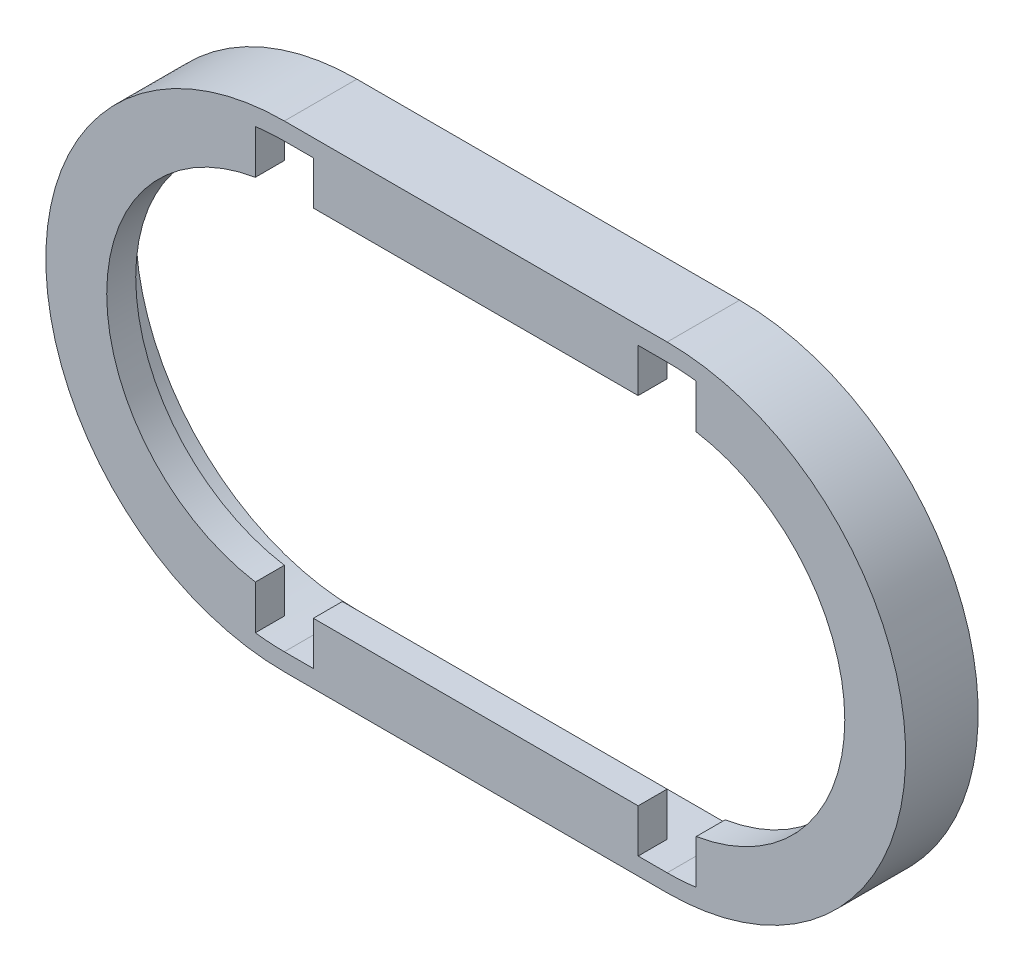
ISO-10303-21;
HEADER;
FILE_DESCRIPTION(('STEP AP214'),'2;1');
FILE_NAME('part.step','',(''),(''),'','','');
FILE_SCHEMA(('AUTOMOTIVE_DESIGN { 1 0 10303 214 1 1 1 1 }'));
ENDSEC;
DATA;
#1=APPLICATION_CONTEXT('core data for automotive mechanical design processes');
#2=APPLICATION_PROTOCOL_DEFINITION('international standard','automotive_design',2000,#1);
#3=PRODUCT_CONTEXT('',#1,'mechanical');
#4=PRODUCT('Part','Part','',(#3));
#5=PRODUCT_RELATED_PRODUCT_CATEGORY('part','',(#4));
#6=PRODUCT_DEFINITION_FORMATION('','',#4);
#7=PRODUCT_DEFINITION_CONTEXT('part definition',#1,'design');
#8=PRODUCT_DEFINITION('design','',#6,#7);
#9=PRODUCT_DEFINITION_SHAPE('','',#8);
#10=(LENGTH_UNIT() NAMED_UNIT(*) SI_UNIT(.MILLI.,.METRE.));
#11=(NAMED_UNIT(*) PLANE_ANGLE_UNIT() SI_UNIT($,.RADIAN.));
#12=(NAMED_UNIT(*) SI_UNIT($,.STERADIAN.) SOLID_ANGLE_UNIT());
#13=UNCERTAINTY_MEASURE_WITH_UNIT(LENGTH_MEASURE(1.E-05),#10,'distance_accuracy_value','');
#14=(GEOMETRIC_REPRESENTATION_CONTEXT(3) GLOBAL_UNCERTAINTY_ASSIGNED_CONTEXT((#13)) GLOBAL_UNIT_ASSIGNED_CONTEXT((#10,
#11,#12)) REPRESENTATION_CONTEXT('',''));
#15=CARTESIAN_POINT('',(0.,0.,0.));
#16=DIRECTION('',(0.,0.,1.));
#17=DIRECTION('',(1.,0.,0.));
#18=AXIS2_PLACEMENT_3D('',#15,#16,#17);
#19=CARTESIAN_POINT('',(-34.3844441888366,-11.7807833808039,2.));
#20=DIRECTION('',(0.,1.,0.));
#21=DIRECTION('',(0.,0.,1.));
#22=AXIS2_PLACEMENT_3D('',#19,#20,#21);
#23=PLANE('',#22);
#24=DIRECTION('',(-1.,0.,0.));
#25=VECTOR('',#24,1.);
#26=CARTESIAN_POINT('',(0.,-11.7807833808039,0.));
#27=LINE('',#26,#25);
#28=CARTESIAN_POINT('',(-9.98444418883663,-11.7807833808039,0.));
#29=VERTEX_POINT('',#28);
#30=CARTESIAN_POINT('',(-32.3844441888366,-11.7807833808039,0.));
#31=VERTEX_POINT('',#30);
#32=EDGE_CURVE('E50',#29,#31,#27,.T.);
#33=ORIENTED_EDGE('',*,*,#32,.F.);
#34=DIRECTION('',(0.,0.,1.));
#35=VECTOR('',#34,1.);
#36=CARTESIAN_POINT('',(-9.98444418883663,-11.7807833808039,0.));
#37=LINE('',#36,#35);
#38=CARTESIAN_POINT('',(-9.98444418883663,-11.7807833808039,2.));
#39=VERTEX_POINT('',#38);
#40=EDGE_CURVE('E227',#29,#39,#37,.T.);
#41=ORIENTED_EDGE('',*,*,#40,.T.);
#42=DIRECTION('',(1.,0.,0.));
#43=VECTOR('',#42,1.);
#44=CARTESIAN_POINT('',(-34.3844441888366,-11.7807833808039,2.));
#45=LINE('',#44,#43);
#46=CARTESIAN_POINT('',(-7.98444418883663,-11.7807833808039,2.));
#47=VERTEX_POINT('',#46);
#48=EDGE_CURVE('E339',#39,#47,#45,.T.);
#49=ORIENTED_EDGE('',*,*,#48,.T.);
#50=DIRECTION('',(0.,0.,-1.));
#51=VECTOR('',#50,1.);
#52=CARTESIAN_POINT('',(-7.98444418883663,-11.7807833808039,2.));
#53=LINE('',#52,#51);
#54=CARTESIAN_POINT('',(-7.98444418883663,-11.7807833808039,-3.));
#55=VERTEX_POINT('',#54);
#56=EDGE_CURVE('E352',#47,#55,#53,.T.);
#57=ORIENTED_EDGE('',*,*,#56,.T.);
#58=DIRECTION('',(1.,0.,0.));
#59=VECTOR('',#58,1.);
#60=CARTESIAN_POINT('',(-34.3844441888366,-11.7807833808039,-3.));
#61=LINE('',#60,#59);
#62=CARTESIAN_POINT('',(-34.3844441888366,-11.7807833808039,-3.));
#63=VERTEX_POINT('',#62);
#64=EDGE_CURVE('E315',#63,#55,#61,.T.);
#65=ORIENTED_EDGE('',*,*,#64,.F.);
#66=DIRECTION('',(0.,0.,-1.));
#67=VECTOR('',#66,1.);
#68=CARTESIAN_POINT('',(-34.3844441888366,-11.7807833808039,2.));
#69=LINE('',#68,#67);
#70=CARTESIAN_POINT('',(-34.3844441888366,-11.7807833808039,2.));
#71=VERTEX_POINT('',#70);
#72=EDGE_CURVE('E354',#71,#63,#69,.T.);
#73=ORIENTED_EDGE('',*,*,#72,.F.);
#74=CARTESIAN_POINT('',(-32.3844441888366,-11.7807833808039,2.));
#75=VERTEX_POINT('',#74);
#76=EDGE_CURVE('E340',#71,#75,#45,.T.);
#77=ORIENTED_EDGE('',*,*,#76,.T.);
#78=DIRECTION('',(0.,0.,1.));
#79=VECTOR('',#78,1.);
#80=CARTESIAN_POINT('',(-32.3844441888366,-11.7807833808039,0.));
#81=LINE('',#80,#79);
#82=EDGE_CURVE('E55',#31,#75,#81,.T.);
#83=ORIENTED_EDGE('',*,*,#82,.F.);
#84=EDGE_LOOP('',(#33,#41,#49,#57,#65,#73,#77,#83));
#85=FACE_BOUND('',#84,.T.);
#86=ADVANCED_FACE('F35',(#85),#23,.T.);
#87=CARTESIAN_POINT('',(-34.3844441888366,3.46921661919612,2.));
#88=DIRECTION('',(0.,0.,-1.));
#89=DIRECTION('',(-1.,0.,0.));
#90=AXIS2_PLACEMENT_3D('',#87,#88,#89);
#91=CYLINDRICAL_SURFACE('',#90,15.25);
#92=CARTESIAN_POINT('',(-34.3844441888366,3.46921661919612,0.));
#93=DIRECTION('',(0.,0.,1.));
#94=DIRECTION('',(1.,0.,0.));
#95=AXIS2_PLACEMENT_3D('',#92,#93,#94);
#96=CIRCLE('',#95,15.25);
#97=CARTESIAN_POINT('',(-36.3844441888366,-11.6490670135447,0.));
#98=VERTEX_POINT('',#97);
#99=CARTESIAN_POINT('',(-36.3844441888366,18.587500251937,0.));
#100=VERTEX_POINT('',#99);
#101=EDGE_CURVE('E292',#98,#100,#96,.F.);
#102=ORIENTED_EDGE('',*,*,#101,.F.);
#103=DIRECTION('',(0.,0.,1.));
#104=VECTOR('',#103,1.);
#105=CARTESIAN_POINT('',(-36.3844441888366,-11.6490670135447,0.));
#106=LINE('',#105,#104);
#107=CARTESIAN_POINT('',(-36.3844441888366,-11.6490670135447,2.));
#108=VERTEX_POINT('',#107);
#109=EDGE_CURVE('E304',#98,#108,#106,.T.);
#110=ORIENTED_EDGE('',*,*,#109,.T.);
#111=CARTESIAN_POINT('',(-34.3844441888366,3.46921661919612,2.));
#112=DIRECTION('',(0.,0.,1.));
#113=DIRECTION('',(1.,0.,0.));
#114=AXIS2_PLACEMENT_3D('',#111,#112,#113);
#115=CIRCLE('',#114,15.25);
#116=EDGE_CURVE('E336',#108,#71,#115,.T.);
#117=ORIENTED_EDGE('',*,*,#116,.T.);
#118=ORIENTED_EDGE('',*,*,#72,.T.);
#119=CARTESIAN_POINT('',(-34.3844441888366,3.46921661919612,-3.));
#120=DIRECTION('',(0.,0.,1.));
#121=DIRECTION('',(1.,0.,0.));
#122=AXIS2_PLACEMENT_3D('',#119,#120,#121);
#123=CIRCLE('',#122,15.25);
#124=CARTESIAN_POINT('',(-34.3844441888366,18.7192166191961,-3.));
#125=VERTEX_POINT('',#124);
#126=EDGE_CURVE('E303',#125,#63,#123,.T.);
#127=ORIENTED_EDGE('',*,*,#126,.F.);
#128=DIRECTION('',(0.,0.,-1.));
#129=VECTOR('',#128,1.);
#130=CARTESIAN_POINT('',(-34.3844441888366,18.7192166191961,2.));
#131=LINE('',#130,#129);
#132=CARTESIAN_POINT('',(-34.3844441888366,18.7192166191961,2.));
#133=VERTEX_POINT('',#132);
#134=EDGE_CURVE('E348',#133,#125,#131,.T.);
#135=ORIENTED_EDGE('',*,*,#134,.F.);
#136=CARTESIAN_POINT('',(-36.3844441888366,18.587500251937,2.));
#137=VERTEX_POINT('',#136);
#138=EDGE_CURVE('E337',#133,#137,#115,.T.);
#139=ORIENTED_EDGE('',*,*,#138,.T.);
#140=DIRECTION('',(0.,0.,1.));
#141=VECTOR('',#140,1.);
#142=CARTESIAN_POINT('',(-36.3844441888366,18.587500251937,0.));
#143=LINE('',#142,#141);
#144=EDGE_CURVE('E307',#100,#137,#143,.T.);
#145=ORIENTED_EDGE('',*,*,#144,.F.);
#146=EDGE_LOOP('',(#102,#110,#117,#118,#127,#135,#139,#145));
#147=FACE_BOUND('',#146,.T.);
#148=ADVANCED_FACE('F392',(#147),#91,.F.);
#149=CARTESIAN_POINT('',(-34.3844441888366,3.46921661919612,2.));
#150=DIRECTION('',(0.,0.,1.));
#151=DIRECTION('',(1.,0.,0.));
#152=AXIS2_PLACEMENT_3D('',#149,#150,#151);
#153=PLANE('',#152);
#154=CARTESIAN_POINT('',(-34.3844441888366,3.46921661919612,2.));
#155=DIRECTION('',(0.,0.,1.));
#156=DIRECTION('',(1.,0.,0.));
#157=AXIS2_PLACEMENT_3D('',#154,#155,#156);
#158=CIRCLE('',#157,16.45);
#159=CARTESIAN_POINT('',(-34.3844441888366,19.9192166191961,2.));
#160=VERTEX_POINT('',#159);
#161=CARTESIAN_POINT('',(-34.3844441888366,-12.9807833808039,2.));
#162=VERTEX_POINT('',#161);
#163=EDGE_CURVE('E356',#160,#162,#158,.T.);
#164=ORIENTED_EDGE('',*,*,#163,.T.);
#165=DIRECTION('',(1.,0.,0.));
#166=VECTOR('',#165,1.);
#167=CARTESIAN_POINT('',(-34.3844441888366,-12.9807833808039,2.));
#168=LINE('',#167,#166);
#169=CARTESIAN_POINT('',(-7.98444418883663,-12.9807833808039,2.));
#170=VERTEX_POINT('',#169);
#171=EDGE_CURVE('E359',#162,#170,#168,.T.);
#172=ORIENTED_EDGE('',*,*,#171,.T.);
#173=CARTESIAN_POINT('',(-7.98444418883663,3.46921661919612,2.));
#174=DIRECTION('',(0.,0.,1.));
#175=DIRECTION('',(1.,0.,0.));
#176=AXIS2_PLACEMENT_3D('',#173,#174,#175);
#177=CIRCLE('',#176,16.45);
#178=CARTESIAN_POINT('',(-7.98444418883663,19.9192166191961,2.));
#179=VERTEX_POINT('',#178);
#180=EDGE_CURVE('E361',#170,#179,#177,.T.);
#181=ORIENTED_EDGE('',*,*,#180,.T.);
#182=DIRECTION('',(-1.,0.,0.));
#183=VECTOR('',#182,1.);
#184=CARTESIAN_POINT('',(-34.3844441888366,19.9192166191961,2.));
#185=LINE('',#184,#183);
#186=EDGE_CURVE('E363',#179,#160,#185,.T.);
#187=ORIENTED_EDGE('',*,*,#186,.T.);
#188=EDGE_LOOP('',(#164,#172,#181,#187));
#189=FACE_BOUND('',#188,.T.);
#190=ORIENTED_EDGE('',*,*,#76,.F.);
#191=ORIENTED_EDGE('',*,*,#116,.F.);
#192=DIRECTION('',(0.,-1.,0.));
#193=VECTOR('',#192,1.);
#194=CARTESIAN_POINT('',(-36.3844441888366,0.,2.));
#195=LINE('',#194,#193);
#196=CARTESIAN_POINT('',(-36.3844441888366,-8.6164153460757,2.));
#197=VERTEX_POINT('',#196);
#198=EDGE_CURVE('E290',#197,#108,#195,.T.);
#199=ORIENTED_EDGE('',*,*,#198,.F.);
#200=CARTESIAN_POINT('',(-34.3844441888366,3.46921661919612,2.));
#201=DIRECTION('',(0.,0.,1.));
#202=DIRECTION('',(1.,0.,0.));
#203=AXIS2_PLACEMENT_3D('',#200,#201,#202);
#204=CIRCLE('',#203,12.25);
#205=CARTESIAN_POINT('',(-36.3844441888366,15.5548485844679,2.));
#206=VERTEX_POINT('',#205);
#207=EDGE_CURVE('E279',#206,#197,#204,.T.);
#208=ORIENTED_EDGE('',*,*,#207,.F.);
#209=EDGE_CURVE('E298',#137,#206,#195,.T.);
#210=ORIENTED_EDGE('',*,*,#209,.F.);
#211=ORIENTED_EDGE('',*,*,#138,.F.);
#212=DIRECTION('',(-1.,0.,0.));
#213=VECTOR('',#212,1.);
#214=CARTESIAN_POINT('',(-34.3844441888366,18.7192166191961,2.));
#215=LINE('',#214,#213);
#216=CARTESIAN_POINT('',(-32.3844441888366,18.7192166191961,2.));
#217=VERTEX_POINT('',#216);
#218=EDGE_CURVE('E345',#217,#133,#215,.T.);
#219=ORIENTED_EDGE('',*,*,#218,.F.);
#220=DIRECTION('',(0.,-1.,0.));
#221=VECTOR('',#220,1.);
#222=CARTESIAN_POINT('',(-32.3844441888366,0.,2.));
#223=LINE('',#222,#221);
#224=CARTESIAN_POINT('',(-32.3844441888366,15.7192166191961,2.));
#225=VERTEX_POINT('',#224);
#226=EDGE_CURVE('E247',#217,#225,#223,.T.);
#227=ORIENTED_EDGE('',*,*,#226,.T.);
#228=DIRECTION('',(1.,0.,0.));
#229=VECTOR('',#228,1.);
#230=CARTESIAN_POINT('',(0.,15.7192166191961,2.));
#231=LINE('',#230,#229);
#232=CARTESIAN_POINT('',(-9.98444418883663,15.7192166191961,2.));
#233=VERTEX_POINT('',#232);
#234=EDGE_CURVE('E271',#225,#233,#231,.T.);
#235=ORIENTED_EDGE('',*,*,#234,.T.);
#236=DIRECTION('',(0.,-1.,0.));
#237=VECTOR('',#236,1.);
#238=CARTESIAN_POINT('',(-9.98444418883663,0.,2.));
#239=LINE('',#238,#237);
#240=CARTESIAN_POINT('',(-9.98444418883663,18.7192166191961,2.));
#241=VERTEX_POINT('',#240);
#242=EDGE_CURVE('E260',#241,#233,#239,.T.);
#243=ORIENTED_EDGE('',*,*,#242,.F.);
#244=CARTESIAN_POINT('',(-7.98444418883663,18.7192166191961,2.));
#245=VERTEX_POINT('',#244);
#246=EDGE_CURVE('E346',#245,#241,#215,.T.);
#247=ORIENTED_EDGE('',*,*,#246,.F.);
#248=CARTESIAN_POINT('',(-7.98444418883663,3.46921661919612,2.));
#249=DIRECTION('',(0.,0.,1.));
#250=DIRECTION('',(1.,0.,0.));
#251=AXIS2_PLACEMENT_3D('',#248,#249,#250);
#252=CIRCLE('',#251,15.25);
#253=CARTESIAN_POINT('',(-5.98444418883663,18.587500251937,2.));
#254=VERTEX_POINT('',#253);
#255=EDGE_CURVE('E342',#254,#245,#252,.T.);
#256=ORIENTED_EDGE('',*,*,#255,.F.);
#257=DIRECTION('',(0.,-1.,0.));
#258=VECTOR('',#257,1.);
#259=CARTESIAN_POINT('',(-5.98444418883663,0.,2.));
#260=LINE('',#259,#258);
#261=CARTESIAN_POINT('',(-5.98444418883663,15.554848584468,2.));
#262=VERTEX_POINT('',#261);
#263=EDGE_CURVE('E233',#254,#262,#260,.T.);
#264=ORIENTED_EDGE('',*,*,#263,.T.);
#265=CARTESIAN_POINT('',(-7.98444418883655,3.46921661919613,2.));
#266=DIRECTION('',(0.,0.,1.));
#267=DIRECTION('',(1.,0.,0.));
#268=AXIS2_PLACEMENT_3D('',#265,#266,#267);
#269=CIRCLE('',#268,12.25);
#270=CARTESIAN_POINT('',(-5.98444418883663,-8.61641534607571,2.));
#271=VERTEX_POINT('',#270);
#272=EDGE_CURVE('E226',#271,#262,#269,.T.);
#273=ORIENTED_EDGE('',*,*,#272,.F.);
#274=CARTESIAN_POINT('',(-5.98444418883663,-11.6490670135447,2.));
#275=VERTEX_POINT('',#274);
#276=EDGE_CURVE('E242',#271,#275,#260,.T.);
#277=ORIENTED_EDGE('',*,*,#276,.T.);
#278=EDGE_CURVE('E343',#47,#275,#252,.T.);
#279=ORIENTED_EDGE('',*,*,#278,.F.);
#280=ORIENTED_EDGE('',*,*,#48,.F.);
#281=DIRECTION('',(0.,-1.,0.));
#282=VECTOR('',#281,1.);
#283=CARTESIAN_POINT('',(-9.98444418883663,0.,2.));
#284=LINE('',#283,#282);
#285=CARTESIAN_POINT('',(-9.98444418883663,-8.78078338080388,2.));
#286=VERTEX_POINT('',#285);
#287=EDGE_CURVE('E213',#286,#39,#284,.T.);
#288=ORIENTED_EDGE('',*,*,#287,.F.);
#289=DIRECTION('',(1.,0.,0.));
#290=VECTOR('',#289,1.);
#291=CARTESIAN_POINT('',(0.,-8.78078338080388,2.));
#292=LINE('',#291,#290);
#293=CARTESIAN_POINT('',(-32.3844441888366,-8.78078338080388,2.));
#294=VERTEX_POINT('',#293);
#295=EDGE_CURVE('E220',#294,#286,#292,.T.);
#296=ORIENTED_EDGE('',*,*,#295,.F.);
#297=DIRECTION('',(0.,-1.,0.));
#298=VECTOR('',#297,1.);
#299=CARTESIAN_POINT('',(-32.3844441888366,0.,2.));
#300=LINE('',#299,#298);
#301=EDGE_CURVE('E200',#294,#75,#300,.T.);
#302=ORIENTED_EDGE('',*,*,#301,.T.);
#303=EDGE_LOOP('',(#190,#191,#199,#208,#210,#211,#219,#227,#235,#243,#247,#256,#264,#273,#277,
#279,#280,#288,#296,#302));
#304=FACE_BOUND('',#303,.T.);
#305=ADVANCED_FACE('F389',(#189,#304),#153,.T.);
#306=CARTESIAN_POINT('',(-34.3844441888366,3.46921661919612,2.));
#307=DIRECTION('',(0.,0.,-1.));
#308=DIRECTION('',(-1.,0.,0.));
#309=AXIS2_PLACEMENT_3D('',#306,#307,#308);
#310=CYLINDRICAL_SURFACE('',#309,16.45);
#311=DIRECTION('',(0.,0.,-1.));
#312=VECTOR('',#311,1.);
#313=CARTESIAN_POINT('',(-34.3844441888366,19.9192166191961,2.));
#314=LINE('',#313,#312);
#315=CARTESIAN_POINT('',(-34.3844441888366,19.9192166191961,-3.));
#316=VERTEX_POINT('',#315);
#317=EDGE_CURVE('E365',#160,#316,#314,.T.);
#318=ORIENTED_EDGE('',*,*,#317,.T.);
#319=CARTESIAN_POINT('',(-34.3844441888366,3.46921661919612,-3.));
#320=DIRECTION('',(0.,0.,1.));
#321=DIRECTION('',(1.,0.,0.));
#322=AXIS2_PLACEMENT_3D('',#319,#320,#321);
#323=CIRCLE('',#322,16.45);
#324=CARTESIAN_POINT('',(-34.3844441888366,-12.9807833808039,-3.));
#325=VERTEX_POINT('',#324);
#326=EDGE_CURVE('E324',#316,#325,#323,.T.);
#327=ORIENTED_EDGE('',*,*,#326,.T.);
#328=DIRECTION('',(0.,0.,-1.));
#329=VECTOR('',#328,1.);
#330=CARTESIAN_POINT('',(-34.3844441888366,-12.9807833808039,2.));
#331=LINE('',#330,#329);
#332=EDGE_CURVE('E11',#162,#325,#331,.T.);
#333=ORIENTED_EDGE('',*,*,#332,.F.);
#334=ORIENTED_EDGE('',*,*,#163,.F.);
#335=EDGE_LOOP('',(#318,#327,#333,#334));
#336=FACE_BOUND('',#335,.T.);
#337=ADVANCED_FACE('F37',(#336),#310,.T.);
#338=CARTESIAN_POINT('',(-34.3844441888366,-12.9807833808039,2.));
#339=DIRECTION('',(0.,1.,0.));
#340=DIRECTION('',(0.,0.,1.));
#341=AXIS2_PLACEMENT_3D('',#338,#339,#340);
#342=PLANE('',#341);
#343=ORIENTED_EDGE('',*,*,#332,.T.);
#344=DIRECTION('',(1.,0.,0.));
#345=VECTOR('',#344,1.);
#346=CARTESIAN_POINT('',(-34.3844441888366,-12.9807833808039,-3.));
#347=LINE('',#346,#345);
#348=CARTESIAN_POINT('',(-7.98444418883663,-12.9807833808039,-3.));
#349=VERTEX_POINT('',#348);
#350=EDGE_CURVE('E327',#325,#349,#347,.T.);
#351=ORIENTED_EDGE('',*,*,#350,.T.);
#352=DIRECTION('',(0.,0.,-1.));
#353=VECTOR('',#352,1.);
#354=CARTESIAN_POINT('',(-7.98444418883663,-12.9807833808039,2.));
#355=LINE('',#354,#353);
#356=EDGE_CURVE('E43',#170,#349,#355,.T.);
#357=ORIENTED_EDGE('',*,*,#356,.F.);
#358=ORIENTED_EDGE('',*,*,#171,.F.);
#359=EDGE_LOOP('',(#343,#351,#357,#358));
#360=FACE_BOUND('',#359,.T.);
#361=ADVANCED_FACE('F380',(#360),#342,.F.);
#362=CARTESIAN_POINT('',(-7.98444418883663,3.46921661919612,2.));
#363=DIRECTION('',(0.,0.,-1.));
#364=DIRECTION('',(-1.,0.,0.));
#365=AXIS2_PLACEMENT_3D('',#362,#363,#364);
#366=CYLINDRICAL_SURFACE('',#365,16.45);
#367=ORIENTED_EDGE('',*,*,#356,.T.);
#368=CARTESIAN_POINT('',(-7.98444418883663,3.46921661919612,-3.));
#369=DIRECTION('',(0.,0.,1.));
#370=DIRECTION('',(1.,0.,0.));
#371=AXIS2_PLACEMENT_3D('',#368,#369,#370);
#372=CIRCLE('',#371,16.45);
#373=CARTESIAN_POINT('',(-7.98444418883663,19.9192166191961,-3.));
#374=VERTEX_POINT('',#373);
#375=EDGE_CURVE('E330',#349,#374,#372,.T.);
#376=ORIENTED_EDGE('',*,*,#375,.T.);
#377=DIRECTION('',(0.,0.,-1.));
#378=VECTOR('',#377,1.);
#379=CARTESIAN_POINT('',(-7.98444418883663,19.9192166191961,2.));
#380=LINE('',#379,#378);
#381=EDGE_CURVE('E367',#179,#374,#380,.T.);
#382=ORIENTED_EDGE('',*,*,#381,.F.);
#383=ORIENTED_EDGE('',*,*,#180,.F.);
#384=EDGE_LOOP('',(#367,#376,#382,#383));
#385=FACE_BOUND('',#384,.T.);
#386=ADVANCED_FACE('F372',(#385),#366,.T.);
#387=CARTESIAN_POINT('',(-34.3844441888366,19.9192166191961,2.));
#388=DIRECTION('',(0.,-1.,0.));
#389=DIRECTION('',(0.,0.,-1.));
#390=AXIS2_PLACEMENT_3D('',#387,#388,#389);
#391=PLANE('',#390);
#392=ORIENTED_EDGE('',*,*,#381,.T.);
#393=DIRECTION('',(-1.,0.,0.));
#394=VECTOR('',#393,1.);
#395=CARTESIAN_POINT('',(-34.3844441888366,19.9192166191961,-3.));
#396=LINE('',#395,#394);
#397=EDGE_CURVE('E333',#374,#316,#396,.T.);
#398=ORIENTED_EDGE('',*,*,#397,.T.);
#399=ORIENTED_EDGE('',*,*,#317,.F.);
#400=ORIENTED_EDGE('',*,*,#186,.F.);
#401=EDGE_LOOP('',(#392,#398,#399,#400));
#402=FACE_BOUND('',#401,.T.);
#403=ADVANCED_FACE('F386',(#402),#391,.F.);
#404=CARTESIAN_POINT('',(-7.98444418883663,3.46921661919612,2.));
#405=DIRECTION('',(0.,0.,-1.));
#406=DIRECTION('',(-1.,0.,0.));
#407=AXIS2_PLACEMENT_3D('',#404,#405,#406);
#408=CYLINDRICAL_SURFACE('',#407,15.25);
#409=DIRECTION('',(0.,0.,1.));
#410=VECTOR('',#409,1.);
#411=CARTESIAN_POINT('',(-5.98444418883663,18.587500251937,0.));
#412=LINE('',#411,#410);
#413=CARTESIAN_POINT('',(-5.98444418883663,18.587500251937,0.));
#414=VERTEX_POINT('',#413);
#415=EDGE_CURVE('E248',#414,#254,#412,.T.);
#416=ORIENTED_EDGE('',*,*,#415,.T.);
#417=ORIENTED_EDGE('',*,*,#255,.T.);
#418=DIRECTION('',(0.,0.,-1.));
#419=VECTOR('',#418,1.);
#420=CARTESIAN_POINT('',(-7.98444418883663,18.7192166191961,2.));
#421=LINE('',#420,#419);
#422=CARTESIAN_POINT('',(-7.98444418883663,18.7192166191961,-3.));
#423=VERTEX_POINT('',#422);
#424=EDGE_CURVE('E350',#245,#423,#421,.T.);
#425=ORIENTED_EDGE('',*,*,#424,.T.);
#426=CARTESIAN_POINT('',(-7.98444418883663,3.46921661919612,-3.));
#427=DIRECTION('',(0.,0.,1.));
#428=DIRECTION('',(1.,0.,0.));
#429=AXIS2_PLACEMENT_3D('',#426,#427,#428);
#430=CIRCLE('',#429,15.25);
#431=EDGE_CURVE('E318',#55,#423,#430,.T.);
#432=ORIENTED_EDGE('',*,*,#431,.F.);
#433=ORIENTED_EDGE('',*,*,#56,.F.);
#434=ORIENTED_EDGE('',*,*,#278,.T.);
#435=DIRECTION('',(0.,0.,1.));
#436=VECTOR('',#435,1.);
#437=CARTESIAN_POINT('',(-5.98444418883663,-11.6490670135447,0.));
#438=LINE('',#437,#436);
#439=CARTESIAN_POINT('',(-5.98444418883663,-11.6490670135447,0.));
#440=VERTEX_POINT('',#439);
#441=EDGE_CURVE('E251',#440,#275,#438,.T.);
#442=ORIENTED_EDGE('',*,*,#441,.F.);
#443=CARTESIAN_POINT('',(-7.98444418883663,3.46921661919612,0.));
#444=DIRECTION('',(0.,0.,1.));
#445=DIRECTION('',(1.,0.,0.));
#446=AXIS2_PLACEMENT_3D('',#443,#444,#445);
#447=CIRCLE('',#446,15.25);
#448=EDGE_CURVE('E236',#414,#440,#447,.F.);
#449=ORIENTED_EDGE('',*,*,#448,.F.);
#450=EDGE_LOOP('',(#416,#417,#425,#432,#433,#434,#442,#449));
#451=FACE_BOUND('',#450,.T.);
#452=ADVANCED_FACE('F437',(#451),#408,.F.);
#453=CARTESIAN_POINT('',(-34.3844441888366,18.7192166191961,2.));
#454=DIRECTION('',(0.,-1.,0.));
#455=DIRECTION('',(1.,0.,0.));
#456=AXIS2_PLACEMENT_3D('',#453,#454,#455);
#457=PLANE('',#456);
#458=DIRECTION('',(0.,0.,1.));
#459=VECTOR('',#458,1.);
#460=CARTESIAN_POINT('',(-32.3844441888366,18.7192166191961,0.));
#461=LINE('',#460,#459);
#462=CARTESIAN_POINT('',(-32.3844441888366,18.7192166191961,0.));
#463=VERTEX_POINT('',#462);
#464=EDGE_CURVE('E276',#463,#217,#461,.T.);
#465=ORIENTED_EDGE('',*,*,#464,.T.);
#466=ORIENTED_EDGE('',*,*,#218,.T.);
#467=ORIENTED_EDGE('',*,*,#134,.T.);
#468=DIRECTION('',(-1.,0.,0.));
#469=VECTOR('',#468,1.);
#470=CARTESIAN_POINT('',(-34.3844441888366,18.7192166191961,-3.));
#471=LINE('',#470,#469);
#472=EDGE_CURVE('E321',#423,#125,#471,.T.);
#473=ORIENTED_EDGE('',*,*,#472,.F.);
#474=ORIENTED_EDGE('',*,*,#424,.F.);
#475=ORIENTED_EDGE('',*,*,#246,.T.);
#476=DIRECTION('',(0.,0.,1.));
#477=VECTOR('',#476,1.);
#478=CARTESIAN_POINT('',(-9.98444418883663,18.7192166191961,0.));
#479=LINE('',#478,#477);
#480=CARTESIAN_POINT('',(-9.98444418883663,18.7192166191961,0.));
#481=VERTEX_POINT('',#480);
#482=EDGE_CURVE('E280',#481,#241,#479,.T.);
#483=ORIENTED_EDGE('',*,*,#482,.F.);
#484=DIRECTION('',(1.,0.,0.));
#485=VECTOR('',#484,1.);
#486=CARTESIAN_POINT('',(0.,18.7192166191961,0.));
#487=LINE('',#486,#485);
#488=EDGE_CURVE('E265',#463,#481,#487,.T.);
#489=ORIENTED_EDGE('',*,*,#488,.F.);
#490=EDGE_LOOP('',(#465,#466,#467,#473,#474,#475,#483,#489));
#491=FACE_BOUND('',#490,.T.);
#492=ADVANCED_FACE('F475',(#491),#457,.T.);
#493=CARTESIAN_POINT('',(-34.3844441888366,3.46921661919612,-3.));
#494=DIRECTION('',(0.,0.,1.));
#495=DIRECTION('',(1.,0.,0.));
#496=AXIS2_PLACEMENT_3D('',#493,#494,#495);
#497=PLANE('',#496);
#498=ORIENTED_EDGE('',*,*,#472,.T.);
#499=ORIENTED_EDGE('',*,*,#126,.T.);
#500=ORIENTED_EDGE('',*,*,#64,.T.);
#501=ORIENTED_EDGE('',*,*,#431,.T.);
#502=EDGE_LOOP('',(#498,#499,#500,#501));
#503=FACE_BOUND('',#502,.T.);
#504=ORIENTED_EDGE('',*,*,#326,.F.);
#505=ORIENTED_EDGE('',*,*,#397,.F.);
#506=ORIENTED_EDGE('',*,*,#375,.F.);
#507=ORIENTED_EDGE('',*,*,#350,.F.);
#508=EDGE_LOOP('',(#504,#505,#506,#507));
#509=FACE_BOUND('',#508,.T.);
#510=ADVANCED_FACE('F379',(#503,#509),#497,.F.);
#511=CARTESIAN_POINT('',(-34.3844441888366,3.46921661919612,0.));
#512=DIRECTION('',(0.,0.,1.));
#513=DIRECTION('',(1.,0.,0.));
#514=AXIS2_PLACEMENT_3D('',#511,#512,#513);
#515=CYLINDRICAL_SURFACE('',#514,12.25);
#516=ORIENTED_EDGE('',*,*,#207,.T.);
#517=DIRECTION('',(0.,0.,1.));
#518=VECTOR('',#517,1.);
#519=CARTESIAN_POINT('',(-36.3844441888366,-8.6164153460757,0.));
#520=LINE('',#519,#518);
#521=CARTESIAN_POINT('',(-36.3844441888366,-8.6164153460757,0.));
#522=VERTEX_POINT('',#521);
#523=EDGE_CURVE('E300',#522,#197,#520,.T.);
#524=ORIENTED_EDGE('',*,*,#523,.F.);
#525=CARTESIAN_POINT('',(-34.3844441888366,3.46921661919612,0.));
#526=DIRECTION('',(0.,0.,1.));
#527=DIRECTION('',(1.,0.,0.));
#528=AXIS2_PLACEMENT_3D('',#525,#526,#527);
#529=CIRCLE('',#528,12.25);
#530=CARTESIAN_POINT('',(-36.3844441888366,15.5548485844679,0.));
#531=VERTEX_POINT('',#530);
#532=EDGE_CURVE('E286',#531,#522,#529,.T.);
#533=ORIENTED_EDGE('',*,*,#532,.F.);
#534=DIRECTION('',(0.,0.,1.));
#535=VECTOR('',#534,1.);
#536=CARTESIAN_POINT('',(-36.3844441888366,15.5548485844679,0.));
#537=LINE('',#536,#535);
#538=EDGE_CURVE('E310',#531,#206,#537,.T.);
#539=ORIENTED_EDGE('',*,*,#538,.T.);
#540=EDGE_LOOP('',(#516,#524,#533,#539));
#541=FACE_BOUND('',#540,.T.);
#542=ADVANCED_FACE('F410',(#541),#515,.F.);
#543=CARTESIAN_POINT('',(-36.3844441888366,0.,0.));
#544=DIRECTION('',(-1.,0.,0.));
#545=DIRECTION('',(0.,0.,1.));
#546=AXIS2_PLACEMENT_3D('',#543,#544,#545);
#547=PLANE('',#546);
#548=ORIENTED_EDGE('',*,*,#198,.T.);
#549=ORIENTED_EDGE('',*,*,#109,.F.);
#550=DIRECTION('',(0.,-1.,0.));
#551=VECTOR('',#550,1.);
#552=CARTESIAN_POINT('',(-36.3844441888366,0.,0.));
#553=LINE('',#552,#551);
#554=EDGE_CURVE('E293',#522,#98,#553,.T.);
#555=ORIENTED_EDGE('',*,*,#554,.F.);
#556=ORIENTED_EDGE('',*,*,#523,.T.);
#557=EDGE_LOOP('',(#548,#549,#555,#556));
#558=FACE_BOUND('',#557,.T.);
#559=ADVANCED_FACE('F404',(#558),#547,.F.);
#560=ORIENTED_EDGE('',*,*,#209,.T.);
#561=ORIENTED_EDGE('',*,*,#538,.F.);
#562=EDGE_CURVE('E289',#100,#531,#553,.T.);
#563=ORIENTED_EDGE('',*,*,#562,.F.);
#564=ORIENTED_EDGE('',*,*,#144,.T.);
#565=EDGE_LOOP('',(#560,#561,#563,#564));
#566=FACE_BOUND('',#565,.T.);
#567=ADVANCED_FACE('F415',(#566),#547,.F.);
#568=CARTESIAN_POINT('',(0.,0.,0.));
#569=DIRECTION('',(0.,0.,1.));
#570=DIRECTION('',(1.,0.,0.));
#571=AXIS2_PLACEMENT_3D('',#568,#569,#570);
#572=PLANE('',#571);
#573=ORIENTED_EDGE('',*,*,#532,.T.);
#574=ORIENTED_EDGE('',*,*,#554,.T.);
#575=ORIENTED_EDGE('',*,*,#101,.T.);
#576=ORIENTED_EDGE('',*,*,#562,.T.);
#577=EDGE_LOOP('',(#573,#574,#575,#576));
#578=FACE_BOUND('',#577,.T.);
#579=ADVANCED_FACE('F417',(#578),#572,.F.);
#580=CARTESIAN_POINT('',(-32.3844441888366,0.,0.));
#581=DIRECTION('',(-1.,0.,0.));
#582=DIRECTION('',(0.,0.,1.));
#583=AXIS2_PLACEMENT_3D('',#580,#581,#582);
#584=PLANE('',#583);
#585=ORIENTED_EDGE('',*,*,#226,.F.);
#586=ORIENTED_EDGE('',*,*,#464,.F.);
#587=DIRECTION('',(0.,-1.,0.));
#588=VECTOR('',#587,1.);
#589=CARTESIAN_POINT('',(-32.3844441888366,0.,0.));
#590=LINE('',#589,#588);
#591=CARTESIAN_POINT('',(-32.3844441888366,15.7192166191961,0.));
#592=VERTEX_POINT('',#591);
#593=EDGE_CURVE('E256',#463,#592,#590,.T.);
#594=ORIENTED_EDGE('',*,*,#593,.T.);
#595=DIRECTION('',(0.,0.,1.));
#596=VECTOR('',#595,1.);
#597=CARTESIAN_POINT('',(-32.3844441888366,15.7192166191961,0.));
#598=LINE('',#597,#596);
#599=EDGE_CURVE('E268',#592,#225,#598,.T.);
#600=ORIENTED_EDGE('',*,*,#599,.T.);
#601=EDGE_LOOP('',(#585,#586,#594,#600));
#602=FACE_BOUND('',#601,.T.);
#603=ADVANCED_FACE('F419',(#602),#584,.T.);
#604=CARTESIAN_POINT('',(-9.98444418883663,0.,0.));
#605=DIRECTION('',(-1.,0.,0.));
#606=DIRECTION('',(0.,0.,1.));
#607=AXIS2_PLACEMENT_3D('',#604,#605,#606);
#608=PLANE('',#607);
#609=ORIENTED_EDGE('',*,*,#242,.T.);
#610=DIRECTION('',(0.,0.,1.));
#611=VECTOR('',#610,1.);
#612=CARTESIAN_POINT('',(-9.98444418883663,15.7192166191961,0.));
#613=LINE('',#612,#611);
#614=CARTESIAN_POINT('',(-9.98444418883663,15.7192166191961,0.));
#615=VERTEX_POINT('',#614);
#616=EDGE_CURVE('E283',#615,#233,#613,.T.);
#617=ORIENTED_EDGE('',*,*,#616,.F.);
#618=DIRECTION('',(0.,-1.,0.));
#619=VECTOR('',#618,1.);
#620=CARTESIAN_POINT('',(-9.98444418883663,0.,0.));
#621=LINE('',#620,#619);
#622=EDGE_CURVE('E263',#481,#615,#621,.T.);
#623=ORIENTED_EDGE('',*,*,#622,.F.);
#624=ORIENTED_EDGE('',*,*,#482,.T.);
#625=EDGE_LOOP('',(#609,#617,#623,#624));
#626=FACE_BOUND('',#625,.T.);
#627=ADVANCED_FACE('F425',(#626),#608,.F.);
#628=CARTESIAN_POINT('',(0.,15.7192166191961,0.));
#629=DIRECTION('',(0.,-1.,0.));
#630=DIRECTION('',(0.,0.,-1.));
#631=AXIS2_PLACEMENT_3D('',#628,#629,#630);
#632=PLANE('',#631);
#633=ORIENTED_EDGE('',*,*,#234,.F.);
#634=ORIENTED_EDGE('',*,*,#599,.F.);
#635=DIRECTION('',(1.,0.,0.));
#636=VECTOR('',#635,1.);
#637=CARTESIAN_POINT('',(0.,15.7192166191961,0.));
#638=LINE('',#637,#636);
#639=EDGE_CURVE('E259',#592,#615,#638,.T.);
#640=ORIENTED_EDGE('',*,*,#639,.T.);
#641=ORIENTED_EDGE('',*,*,#616,.T.);
#642=EDGE_LOOP('',(#633,#634,#640,#641));
#643=FACE_BOUND('',#642,.T.);
#644=ADVANCED_FACE('F532',(#643),#632,.T.);
#645=CARTESIAN_POINT('',(0.,0.,0.));
#646=DIRECTION('',(0.,0.,1.));
#647=DIRECTION('',(1.,0.,0.));
#648=AXIS2_PLACEMENT_3D('',#645,#646,#647);
#649=PLANE('',#648);
#650=ORIENTED_EDGE('',*,*,#593,.F.);
#651=ORIENTED_EDGE('',*,*,#488,.T.);
#652=ORIENTED_EDGE('',*,*,#622,.T.);
#653=ORIENTED_EDGE('',*,*,#639,.F.);
#654=EDGE_LOOP('',(#650,#651,#652,#653));
#655=FACE_BOUND('',#654,.T.);
#656=ADVANCED_FACE('F542',(#655),#649,.F.);
#657=CARTESIAN_POINT('',(-7.98444418883655,3.46921661919613,0.));
#658=DIRECTION('',(0.,0.,1.));
#659=DIRECTION('',(1.,0.,0.));
#660=AXIS2_PLACEMENT_3D('',#657,#658,#659);
#661=CYLINDRICAL_SURFACE('',#660,12.25);
#662=ORIENTED_EDGE('',*,*,#272,.T.);
#663=DIRECTION('',(0.,0.,1.));
#664=VECTOR('',#663,1.);
#665=CARTESIAN_POINT('',(-5.98444418883663,15.554848584468,0.));
#666=LINE('',#665,#664);
#667=CARTESIAN_POINT('',(-5.98444418883663,15.554848584468,0.));
#668=VERTEX_POINT('',#667);
#669=EDGE_CURVE('E245',#668,#262,#666,.T.);
#670=ORIENTED_EDGE('',*,*,#669,.F.);
#671=CARTESIAN_POINT('',(-7.98444418883655,3.46921661919613,0.));
#672=DIRECTION('',(0.,0.,1.));
#673=DIRECTION('',(1.,0.,0.));
#674=AXIS2_PLACEMENT_3D('',#671,#672,#673);
#675=CIRCLE('',#674,12.25);
#676=CARTESIAN_POINT('',(-5.98444418883663,-8.61641534607571,0.));
#677=VERTEX_POINT('',#676);
#678=EDGE_CURVE('E230',#677,#668,#675,.T.);
#679=ORIENTED_EDGE('',*,*,#678,.F.);
#680=DIRECTION('',(0.,0.,1.));
#681=VECTOR('',#680,1.);
#682=CARTESIAN_POINT('',(-5.98444418883663,-8.61641534607571,0.));
#683=LINE('',#682,#681);
#684=EDGE_CURVE('E254',#677,#271,#683,.T.);
#685=ORIENTED_EDGE('',*,*,#684,.T.);
#686=EDGE_LOOP('',(#662,#670,#679,#685));
#687=FACE_BOUND('',#686,.T.);
#688=ADVANCED_FACE('F552',(#687),#661,.F.);
#689=CARTESIAN_POINT('',(-5.98444418883663,0.,0.));
#690=DIRECTION('',(-1.,0.,0.));
#691=DIRECTION('',(0.,-1.,0.));
#692=AXIS2_PLACEMENT_3D('',#689,#690,#691);
#693=PLANE('',#692);
#694=ORIENTED_EDGE('',*,*,#263,.F.);
#695=ORIENTED_EDGE('',*,*,#415,.F.);
#696=DIRECTION('',(0.,-1.,0.));
#697=VECTOR('',#696,1.);
#698=CARTESIAN_POINT('',(-5.98444418883663,0.,0.));
#699=LINE('',#698,#697);
#700=EDGE_CURVE('E237',#414,#668,#699,.T.);
#701=ORIENTED_EDGE('',*,*,#700,.T.);
#702=ORIENTED_EDGE('',*,*,#669,.T.);
#703=EDGE_LOOP('',(#694,#695,#701,#702));
#704=FACE_BOUND('',#703,.T.);
#705=ADVANCED_FACE('F562',(#704),#693,.T.);
#706=ORIENTED_EDGE('',*,*,#276,.F.);
#707=ORIENTED_EDGE('',*,*,#684,.F.);
#708=EDGE_CURVE('E232',#677,#440,#699,.T.);
#709=ORIENTED_EDGE('',*,*,#708,.T.);
#710=ORIENTED_EDGE('',*,*,#441,.T.);
#711=EDGE_LOOP('',(#706,#707,#709,#710));
#712=FACE_BOUND('',#711,.T.);
#713=ADVANCED_FACE('F572',(#712),#693,.T.);
#714=CARTESIAN_POINT('',(0.,0.,0.));
#715=DIRECTION('',(0.,0.,1.));
#716=DIRECTION('',(1.,0.,0.));
#717=AXIS2_PLACEMENT_3D('',#714,#715,#716);
#718=PLANE('',#717);
#719=ORIENTED_EDGE('',*,*,#678,.T.);
#720=ORIENTED_EDGE('',*,*,#700,.F.);
#721=ORIENTED_EDGE('',*,*,#448,.T.);
#722=ORIENTED_EDGE('',*,*,#708,.F.);
#723=EDGE_LOOP('',(#719,#720,#721,#722));
#724=FACE_BOUND('',#723,.T.);
#725=ADVANCED_FACE('F582',(#724),#718,.F.);
#726=CARTESIAN_POINT('',(0.,-8.78078338080388,0.));
#727=DIRECTION('',(0.,-1.,0.));
#728=DIRECTION('',(1.,0.,0.));
#729=AXIS2_PLACEMENT_3D('',#726,#727,#728);
#730=PLANE('',#729);
#731=ORIENTED_EDGE('',*,*,#295,.T.);
#732=DIRECTION('',(0.,0.,1.));
#733=VECTOR('',#732,1.);
#734=CARTESIAN_POINT('',(-9.98444418883663,-8.78078338080388,0.));
#735=LINE('',#734,#733);
#736=CARTESIAN_POINT('',(-9.98444418883663,-8.78078338080388,0.));
#737=VERTEX_POINT('',#736);
#738=EDGE_CURVE('E211',#737,#286,#735,.T.);
#739=ORIENTED_EDGE('',*,*,#738,.F.);
#740=DIRECTION('',(1.,0.,0.));
#741=VECTOR('',#740,1.);
#742=CARTESIAN_POINT('',(0.,-8.78078338080388,0.));
#743=LINE('',#742,#741);
#744=CARTESIAN_POINT('',(-32.3844441888366,-8.78078338080388,0.));
#745=VERTEX_POINT('',#744);
#746=EDGE_CURVE('E208',#745,#737,#743,.T.);
#747=ORIENTED_EDGE('',*,*,#746,.F.);
#748=DIRECTION('',(0.,0.,1.));
#749=VECTOR('',#748,1.);
#750=CARTESIAN_POINT('',(-32.3844441888366,-8.78078338080388,0.));
#751=LINE('',#750,#749);
#752=EDGE_CURVE('E194',#745,#294,#751,.T.);
#753=ORIENTED_EDGE('',*,*,#752,.T.);
#754=EDGE_LOOP('',(#731,#739,#747,#753));
#755=FACE_BOUND('',#754,.T.);
#756=ADVANCED_FACE('F209',(#755),#730,.F.);
#757=CARTESIAN_POINT('',(-9.98444418883663,0.,0.));
#758=DIRECTION('',(-1.,0.,0.));
#759=DIRECTION('',(0.,0.,1.));
#760=AXIS2_PLACEMENT_3D('',#757,#758,#759);
#761=PLANE('',#760);
#762=ORIENTED_EDGE('',*,*,#287,.T.);
#763=ORIENTED_EDGE('',*,*,#40,.F.);
#764=DIRECTION('',(0.,-1.,0.));
#765=VECTOR('',#764,1.);
#766=CARTESIAN_POINT('',(-9.98444418883663,0.,0.));
#767=LINE('',#766,#765);
#768=EDGE_CURVE('E204',#737,#29,#767,.T.);
#769=ORIENTED_EDGE('',*,*,#768,.F.);
#770=ORIENTED_EDGE('',*,*,#738,.T.);
#771=EDGE_LOOP('',(#762,#763,#769,#770));
#772=FACE_BOUND('',#771,.T.);
#773=ADVANCED_FACE('F600',(#772),#761,.F.);
#774=CARTESIAN_POINT('',(-32.3844441888366,0.,0.));
#775=DIRECTION('',(-1.,0.,0.));
#776=DIRECTION('',(0.,0.,1.));
#777=AXIS2_PLACEMENT_3D('',#774,#775,#776);
#778=PLANE('',#777);
#779=ORIENTED_EDGE('',*,*,#301,.F.);
#780=ORIENTED_EDGE('',*,*,#752,.F.);
#781=DIRECTION('',(0.,-1.,0.));
#782=VECTOR('',#781,1.);
#783=CARTESIAN_POINT('',(-32.3844441888366,0.,0.));
#784=LINE('',#783,#782);
#785=EDGE_CURVE('E198',#745,#31,#784,.T.);
#786=ORIENTED_EDGE('',*,*,#785,.T.);
#787=ORIENTED_EDGE('',*,*,#82,.T.);
#788=EDGE_LOOP('',(#779,#780,#786,#787));
#789=FACE_BOUND('',#788,.T.);
#790=ADVANCED_FACE('F196',(#789),#778,.T.);
#791=CARTESIAN_POINT('',(0.,0.,0.));
#792=DIRECTION('',(0.,0.,1.));
#793=DIRECTION('',(1.,0.,0.));
#794=AXIS2_PLACEMENT_3D('',#791,#792,#793);
#795=PLANE('',#794);
#796=ORIENTED_EDGE('',*,*,#746,.T.);
#797=ORIENTED_EDGE('',*,*,#768,.T.);
#798=ORIENTED_EDGE('',*,*,#32,.T.);
#799=ORIENTED_EDGE('',*,*,#785,.F.);
#800=EDGE_LOOP('',(#796,#797,#798,#799));
#801=FACE_BOUND('',#800,.T.);
#802=ADVANCED_FACE('F215',(#801),#795,.F.);
#803=CLOSED_SHELL('',(#86,#148,#305,#337,#361,#386,#403,#452,#492,#510,#542,#559,#567,#579,#603,
#627,#644,#656,#688,#705,#713,#725,#756,#773,#790,#802));
#804=MANIFOLD_SOLID_BREP('B2',#803);
#805=ADVANCED_BREP_SHAPE_REPRESENTATION('',(#18,#804),#14);
#806=SHAPE_DEFINITION_REPRESENTATION(#9,#805);
ENDSEC;
END-ISO-10303-21;
